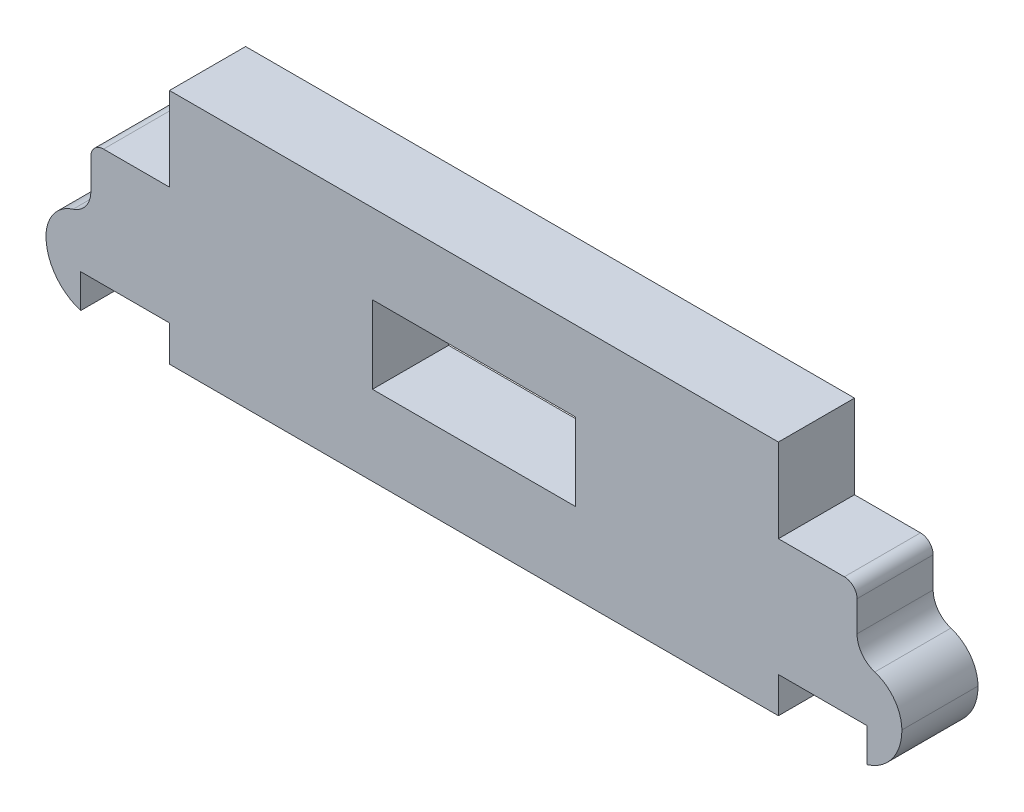
ISO-10303-21;
HEADER;
FILE_DESCRIPTION(('STEP AP214'),'2;1');
FILE_NAME('part.step','',(''),(''),'','','');
FILE_SCHEMA(('AUTOMOTIVE_DESIGN { 1 0 10303 214 1 1 1 1 }'));
ENDSEC;
DATA;
#1=APPLICATION_CONTEXT('core data for automotive mechanical design processes');
#2=APPLICATION_PROTOCOL_DEFINITION('international standard','automotive_design',2000,#1);
#3=PRODUCT_CONTEXT('',#1,'mechanical');
#4=PRODUCT('Part','Part','',(#3));
#5=PRODUCT_RELATED_PRODUCT_CATEGORY('part','',(#4));
#6=PRODUCT_DEFINITION_FORMATION('','',#4);
#7=PRODUCT_DEFINITION_CONTEXT('part definition',#1,'design');
#8=PRODUCT_DEFINITION('design','',#6,#7);
#9=PRODUCT_DEFINITION_SHAPE('','',#8);
#10=(LENGTH_UNIT() NAMED_UNIT(*) SI_UNIT(.MILLI.,.METRE.));
#11=(NAMED_UNIT(*) PLANE_ANGLE_UNIT() SI_UNIT($,.RADIAN.));
#12=(NAMED_UNIT(*) SI_UNIT($,.STERADIAN.) SOLID_ANGLE_UNIT());
#13=UNCERTAINTY_MEASURE_WITH_UNIT(LENGTH_MEASURE(1.E-05),#10,'distance_accuracy_value','');
#14=(GEOMETRIC_REPRESENTATION_CONTEXT(3) GLOBAL_UNCERTAINTY_ASSIGNED_CONTEXT((#13)) GLOBAL_UNIT_ASSIGNED_CONTEXT((#10,
#11,#12)) REPRESENTATION_CONTEXT('',''));
#15=CARTESIAN_POINT('',(0.,0.,0.));
#16=DIRECTION('',(0.,0.,1.));
#17=DIRECTION('',(1.,0.,0.));
#18=AXIS2_PLACEMENT_3D('',#15,#16,#17);
#19=CARTESIAN_POINT('',(-12.6829602097145,5.79977927389886,1.5));
#20=DIRECTION('',(0.,0.,1.));
#21=DIRECTION('',(1.,0.,0.));
#22=AXIS2_PLACEMENT_3D('',#19,#20,#21);
#23=PLANE('',#22);
#24=DIRECTION('',(-1.,0.,0.));
#25=VECTOR('',#24,1.);
#26=CARTESIAN_POINT('',(13.9162907842314,9.59977927389854,1.5));
#27=LINE('',#26,#25);
#28=CARTESIAN_POINT('',(13.9162907842314,9.59977927389854,1.5));
#29=VERTEX_POINT('',#28);
#30=CARTESIAN_POINT('',(-10.0837092157686,9.59977927389854,1.5));
#31=VERTEX_POINT('',#30);
#32=EDGE_CURVE('E243',#29,#31,#27,.T.);
#33=ORIENTED_EDGE('',*,*,#32,.T.);
#34=DIRECTION('',(0.,-1.,0.));
#35=VECTOR('',#34,1.);
#36=CARTESIAN_POINT('',(-10.0837092157686,9.59977927389854,1.5));
#37=LINE('',#36,#35);
#38=CARTESIAN_POINT('',(-10.0837092157686,6.2997792738988,1.5));
#39=VERTEX_POINT('',#38);
#40=EDGE_CURVE('E246',#31,#39,#37,.T.);
#41=ORIENTED_EDGE('',*,*,#40,.T.);
#42=DIRECTION('',(-1.,0.,0.));
#43=VECTOR('',#42,1.);
#44=CARTESIAN_POINT('',(-10.0837092157686,6.2997792738988,1.5));
#45=LINE('',#44,#43);
#46=CARTESIAN_POINT('',(-12.6829602097145,6.2997792738988,1.5));
#47=VERTEX_POINT('',#46);
#48=EDGE_CURVE('E249',#39,#47,#45,.T.);
#49=ORIENTED_EDGE('',*,*,#48,.T.);
#50=CARTESIAN_POINT('',(-12.6829602097145,5.79977927389886,1.5));
#51=DIRECTION('',(0.,0.,1.));
#52=DIRECTION('',(1.,0.,0.));
#53=AXIS2_PLACEMENT_3D('',#50,#51,#52);
#54=CIRCLE('',#53,0.499999999999941);
#55=CARTESIAN_POINT('',(-13.1829602097144,5.79977927389886,1.5));
#56=VERTEX_POINT('',#55);
#57=EDGE_CURVE('E251',#47,#56,#54,.T.);
#58=ORIENTED_EDGE('',*,*,#57,.T.);
#59=DIRECTION('',(0.,-1.,0.));
#60=VECTOR('',#59,1.);
#61=CARTESIAN_POINT('',(-13.1829602097144,5.79977927389886,1.5));
#62=LINE('',#61,#60);
#63=CARTESIAN_POINT('',(-13.1829602097144,4.60236878244591,1.5));
#64=VERTEX_POINT('',#63);
#65=EDGE_CURVE('E253',#56,#64,#62,.T.);
#66=ORIENTED_EDGE('',*,*,#65,.T.);
#67=CARTESIAN_POINT('',(-14.1829602097144,4.60236878244591,1.5));
#68=DIRECTION('',(0.,0.,-1.));
#69=DIRECTION('',(-1.,0.,0.));
#70=AXIS2_PLACEMENT_3D('',#67,#68,#69);
#71=CIRCLE('',#70,0.999999999999995);
#72=CARTESIAN_POINT('',(-13.882635600724,3.64853172653189,1.5));
#73=VERTEX_POINT('',#72);
#74=EDGE_CURVE('E255',#64,#73,#71,.T.);
#75=ORIENTED_EDGE('',*,*,#74,.T.);
#76=CARTESIAN_POINT('',(-13.4242999372272,2.19284835326531,1.5));
#77=DIRECTION('',(0.,0.,1.));
#78=DIRECTION('',(1.,0.,0.));
#79=AXIS2_PLACEMENT_3D('',#76,#77,#78);
#80=CIRCLE('',#79,1.52613422202562);
#81=CARTESIAN_POINT('',(-14.9503955953387,2.20369758969219,1.5));
#82=VERTEX_POINT('',#81);
#83=EDGE_CURVE('E257',#73,#82,#80,.T.);
#84=ORIENTED_EDGE('',*,*,#83,.T.);
#85=CARTESIAN_POINT('',(-13.0087350751829,2.18989404210202,1.5));
#86=DIRECTION('',(0.,0.,1.));
#87=DIRECTION('',(1.,0.,0.));
#88=AXIS2_PLACEMENT_3D('',#85,#86,#87);
#89=CIRCLE('',#88,1.94170958525156);
#90=CARTESIAN_POINT('',(-13.5837092157686,0.335267165580615,1.5));
#91=VERTEX_POINT('',#90);
#92=EDGE_CURVE('E259',#82,#91,#89,.T.);
#93=ORIENTED_EDGE('',*,*,#92,.T.);
#94=DIRECTION('',(0.,1.,0.));
#95=VECTOR('',#94,1.);
#96=CARTESIAN_POINT('',(-13.5837092157686,0.335267165580616,1.5));
#97=LINE('',#96,#95);
#98=CARTESIAN_POINT('',(-13.5837092157686,1.66469561199123,1.5));
#99=VERTEX_POINT('',#98);
#100=EDGE_CURVE('E261',#91,#99,#97,.T.);
#101=ORIENTED_EDGE('',*,*,#100,.T.);
#102=DIRECTION('',(1.,0.,0.));
#103=VECTOR('',#102,1.);
#104=CARTESIAN_POINT('',(-13.5837092157686,1.66469561199123,1.5));
#105=LINE('',#104,#103);
#106=CARTESIAN_POINT('',(-10.0837092157686,1.66469561199123,1.5));
#107=VERTEX_POINT('',#106);
#108=EDGE_CURVE('E263',#99,#107,#105,.T.);
#109=ORIENTED_EDGE('',*,*,#108,.T.);
#110=DIRECTION('',(1.52707640084291E-13,-1.,0.));
#111=VECTOR('',#110,1.);
#112=CARTESIAN_POINT('',(-10.0837092157686,1.66469561199123,1.5));
#113=LINE('',#112,#111);
#114=CARTESIAN_POINT('',(-10.0837092157684,0.256084288403286,1.5));
#115=VERTEX_POINT('',#114);
#116=EDGE_CURVE('E265',#107,#115,#113,.T.);
#117=ORIENTED_EDGE('',*,*,#116,.T.);
#118=DIRECTION('',(1.,0.,0.));
#119=VECTOR('',#118,1.);
#120=CARTESIAN_POINT('',(-10.0837092157684,0.256084288403286,1.5));
#121=LINE('',#120,#119);
#122=CARTESIAN_POINT('',(13.9162907842312,0.256084288403289,1.5));
#123=VERTEX_POINT('',#122);
#124=EDGE_CURVE('E267',#115,#123,#121,.T.);
#125=ORIENTED_EDGE('',*,*,#124,.T.);
#126=DIRECTION('',(1.50244613631318E-13,1.,0.));
#127=VECTOR('',#126,1.);
#128=CARTESIAN_POINT('',(13.9162907842314,1.66469561199123,1.5));
#129=LINE('',#128,#127);
#130=CARTESIAN_POINT('',(13.9162907842314,1.66469561199123,1.5));
#131=VERTEX_POINT('',#130);
#132=EDGE_CURVE('E269',#123,#131,#129,.T.);
#133=ORIENTED_EDGE('',*,*,#132,.T.);
#134=DIRECTION('',(1.,0.,0.));
#135=VECTOR('',#134,1.);
#136=CARTESIAN_POINT('',(17.4162907842314,1.66469561199123,1.5));
#137=LINE('',#136,#135);
#138=CARTESIAN_POINT('',(17.4162907842314,1.66469561199123,1.5));
#139=VERTEX_POINT('',#138);
#140=EDGE_CURVE('E271',#131,#139,#137,.T.);
#141=ORIENTED_EDGE('',*,*,#140,.T.);
#142=DIRECTION('',(0.,-1.,0.));
#143=VECTOR('',#142,1.);
#144=CARTESIAN_POINT('',(17.4162907842314,0.33526716558062,1.5));
#145=LINE('',#144,#143);
#146=CARTESIAN_POINT('',(17.4162907842314,0.33526716558062,1.5));
#147=VERTEX_POINT('',#146);
#148=EDGE_CURVE('E273',#139,#147,#145,.T.);
#149=ORIENTED_EDGE('',*,*,#148,.T.);
#150=CARTESIAN_POINT('',(16.8413166436457,2.18989404210202,1.5));
#151=DIRECTION('',(0.,0.,1.));
#152=DIRECTION('',(-1.,0.,0.));
#153=AXIS2_PLACEMENT_3D('',#150,#151,#152);
#154=CIRCLE('',#153,1.94170958525156);
#155=CARTESIAN_POINT('',(18.7829771638015,2.20369758969219,1.5));
#156=VERTEX_POINT('',#155);
#157=EDGE_CURVE('E275',#147,#156,#154,.T.);
#158=ORIENTED_EDGE('',*,*,#157,.T.);
#159=CARTESIAN_POINT('',(17.25688150569,2.19284835326532,1.5));
#160=DIRECTION('',(0.,0.,1.));
#161=DIRECTION('',(-1.,0.,0.));
#162=AXIS2_PLACEMENT_3D('',#159,#160,#161);
#163=CIRCLE('',#162,1.52613422202562);
#164=CARTESIAN_POINT('',(17.7152171691868,3.64853172653189,1.5));
#165=VERTEX_POINT('',#164);
#166=EDGE_CURVE('E277',#156,#165,#163,.T.);
#167=ORIENTED_EDGE('',*,*,#166,.T.);
#168=CARTESIAN_POINT('',(18.0155417781772,4.60236878244592,1.5));
#169=DIRECTION('',(0.,0.,-1.));
#170=DIRECTION('',(1.,0.,0.));
#171=AXIS2_PLACEMENT_3D('',#168,#169,#170);
#172=CIRCLE('',#171,0.999999999999995);
#173=CARTESIAN_POINT('',(17.0155417781772,4.60236878244592,1.5));
#174=VERTEX_POINT('',#173);
#175=EDGE_CURVE('E279',#165,#174,#172,.T.);
#176=ORIENTED_EDGE('',*,*,#175,.T.);
#177=DIRECTION('',(0.,1.,0.));
#178=VECTOR('',#177,1.);
#179=CARTESIAN_POINT('',(17.0155417781772,5.79977927389886,1.5));
#180=LINE('',#179,#178);
#181=CARTESIAN_POINT('',(17.0155417781772,5.79977927389886,1.5));
#182=VERTEX_POINT('',#181);
#183=EDGE_CURVE('E281',#174,#182,#180,.T.);
#184=ORIENTED_EDGE('',*,*,#183,.T.);
#185=CARTESIAN_POINT('',(16.5155417781772,5.79977927389886,1.5));
#186=DIRECTION('',(0.,0.,1.));
#187=DIRECTION('',(-1.,0.,0.));
#188=AXIS2_PLACEMENT_3D('',#185,#186,#187);
#189=CIRCLE('',#188,0.499999999999941);
#190=CARTESIAN_POINT('',(16.5155417781772,6.2997792738988,1.5));
#191=VERTEX_POINT('',#190);
#192=EDGE_CURVE('E283',#182,#191,#189,.T.);
#193=ORIENTED_EDGE('',*,*,#192,.T.);
#194=DIRECTION('',(-1.,0.,0.));
#195=VECTOR('',#194,1.);
#196=CARTESIAN_POINT('',(13.9162907842314,6.2997792738988,1.5));
#197=LINE('',#196,#195);
#198=CARTESIAN_POINT('',(13.9162907842314,6.2997792738988,1.5));
#199=VERTEX_POINT('',#198);
#200=EDGE_CURVE('E285',#191,#199,#197,.T.);
#201=ORIENTED_EDGE('',*,*,#200,.T.);
#202=DIRECTION('',(0.,1.,0.));
#203=VECTOR('',#202,1.);
#204=CARTESIAN_POINT('',(13.9162907842314,9.59977927389854,1.5));
#205=LINE('',#204,#203);
#206=EDGE_CURVE('E287',#199,#29,#205,.T.);
#207=ORIENTED_EDGE('',*,*,#206,.T.);
#208=EDGE_LOOP('',(#33,#41,#49,#58,#66,#75,#84,#93,#101,#109,#117,#125,#133,#141,#149,#158,#167,
#176,#184,#193,#201,#207));
#209=FACE_BOUND('',#208,.T.);
#210=DIRECTION('',(-1.,0.,0.));
#211=VECTOR('',#210,1.);
#212=CARTESIAN_POINT('',(-2.08370921576841,6.45608428840361,1.5));
#213=LINE('',#212,#211);
#214=CARTESIAN_POINT('',(5.91629078423138,6.45608428840361,1.5));
#215=VERTEX_POINT('',#214);
#216=CARTESIAN_POINT('',(-2.08370921576841,6.45608428840361,1.5));
#217=VERTEX_POINT('',#216);
#218=EDGE_CURVE('E215',#215,#217,#213,.T.);
#219=ORIENTED_EDGE('',*,*,#218,.F.);
#220=DIRECTION('',(0.,1.,0.));
#221=VECTOR('',#220,1.);
#222=CARTESIAN_POINT('',(5.91629078423138,3.39977927389822,1.5));
#223=LINE('',#222,#221);
#224=CARTESIAN_POINT('',(5.91629078423138,3.39977927389822,1.5));
#225=VERTEX_POINT('',#224);
#226=EDGE_CURVE('E207',#225,#215,#223,.T.);
#227=ORIENTED_EDGE('',*,*,#226,.F.);
#228=DIRECTION('',(1.,0.,0.));
#229=VECTOR('',#228,1.);
#230=CARTESIAN_POINT('',(-2.08370921576841,3.39977927389822,1.5));
#231=LINE('',#230,#229);
#232=CARTESIAN_POINT('',(-2.08370921576841,3.39977927389822,1.5));
#233=VERTEX_POINT('',#232);
#234=EDGE_CURVE('E229',#233,#225,#231,.T.);
#235=ORIENTED_EDGE('',*,*,#234,.F.);
#236=DIRECTION('',(0.,-1.,0.));
#237=VECTOR('',#236,1.);
#238=CARTESIAN_POINT('',(-2.08370921576841,3.39977927389822,1.5));
#239=LINE('',#238,#237);
#240=EDGE_CURVE('E227',#217,#233,#239,.T.);
#241=ORIENTED_EDGE('',*,*,#240,.F.);
#242=EDGE_LOOP('',(#219,#227,#235,#241));
#243=FACE_BOUND('',#242,.T.);
#244=ADVANCED_FACE('F34',(#209,#243),#23,.T.);
#245=CARTESIAN_POINT('',(-12.6829602097145,5.79977927389886,-1.5));
#246=DIRECTION('',(0.,0.,1.));
#247=DIRECTION('',(1.,0.,0.));
#248=AXIS2_PLACEMENT_3D('',#245,#246,#247);
#249=PLANE('',#248);
#250=DIRECTION('',(-1.,0.,0.));
#251=VECTOR('',#250,1.);
#252=CARTESIAN_POINT('',(13.9162907842314,9.59977927389854,-1.5));
#253=LINE('',#252,#251);
#254=CARTESIAN_POINT('',(13.9162907842314,9.59977927389854,-1.5));
#255=VERTEX_POINT('',#254);
#256=CARTESIAN_POINT('',(-10.0837092157686,9.59977927389854,-1.5));
#257=VERTEX_POINT('',#256);
#258=EDGE_CURVE('E223',#255,#257,#253,.T.);
#259=ORIENTED_EDGE('',*,*,#258,.F.);
#260=DIRECTION('',(0.,1.,0.));
#261=VECTOR('',#260,1.);
#262=CARTESIAN_POINT('',(13.9162907842314,9.59977927389854,-1.5));
#263=LINE('',#262,#261);
#264=CARTESIAN_POINT('',(13.9162907842314,6.2997792738988,-1.5));
#265=VERTEX_POINT('',#264);
#266=EDGE_CURVE('E247',#265,#255,#263,.T.);
#267=ORIENTED_EDGE('',*,*,#266,.F.);
#268=DIRECTION('',(-1.,0.,0.));
#269=VECTOR('',#268,1.);
#270=CARTESIAN_POINT('',(13.9162907842314,6.2997792738988,-1.5));
#271=LINE('',#270,#269);
#272=CARTESIAN_POINT('',(16.5155417781772,6.2997792738988,-1.5));
#273=VERTEX_POINT('',#272);
#274=EDGE_CURVE('E330',#273,#265,#271,.T.);
#275=ORIENTED_EDGE('',*,*,#274,.F.);
#276=CARTESIAN_POINT('',(16.5155417781772,5.79977927389886,-1.5));
#277=DIRECTION('',(0.,0.,1.));
#278=DIRECTION('',(-1.,0.,0.));
#279=AXIS2_PLACEMENT_3D('',#276,#277,#278);
#280=CIRCLE('',#279,0.499999999999941);
#281=CARTESIAN_POINT('',(17.0155417781772,5.79977927389886,-1.5));
#282=VERTEX_POINT('',#281);
#283=EDGE_CURVE('E328',#282,#273,#280,.T.);
#284=ORIENTED_EDGE('',*,*,#283,.F.);
#285=DIRECTION('',(0.,1.,0.));
#286=VECTOR('',#285,1.);
#287=CARTESIAN_POINT('',(17.0155417781772,5.79977927389886,-1.5));
#288=LINE('',#287,#286);
#289=CARTESIAN_POINT('',(17.0155417781772,4.60236878244592,-1.5));
#290=VERTEX_POINT('',#289);
#291=EDGE_CURVE('E326',#290,#282,#288,.T.);
#292=ORIENTED_EDGE('',*,*,#291,.F.);
#293=CARTESIAN_POINT('',(18.0155417781772,4.60236878244592,-1.5));
#294=DIRECTION('',(0.,0.,-1.));
#295=DIRECTION('',(1.,0.,0.));
#296=AXIS2_PLACEMENT_3D('',#293,#294,#295);
#297=CIRCLE('',#296,0.999999999999995);
#298=CARTESIAN_POINT('',(17.7152171691868,3.64853172653189,-1.5));
#299=VERTEX_POINT('',#298);
#300=EDGE_CURVE('E324',#299,#290,#297,.T.);
#301=ORIENTED_EDGE('',*,*,#300,.F.);
#302=CARTESIAN_POINT('',(17.25688150569,2.19284835326532,-1.5));
#303=DIRECTION('',(0.,0.,1.));
#304=DIRECTION('',(-1.,0.,0.));
#305=AXIS2_PLACEMENT_3D('',#302,#303,#304);
#306=CIRCLE('',#305,1.52613422202562);
#307=CARTESIAN_POINT('',(18.7829771638015,2.20369758969219,-1.5));
#308=VERTEX_POINT('',#307);
#309=EDGE_CURVE('E322',#308,#299,#306,.T.);
#310=ORIENTED_EDGE('',*,*,#309,.F.);
#311=CARTESIAN_POINT('',(16.8413166436457,2.18989404210202,-1.5));
#312=DIRECTION('',(0.,0.,1.));
#313=DIRECTION('',(-1.,0.,0.));
#314=AXIS2_PLACEMENT_3D('',#311,#312,#313);
#315=CIRCLE('',#314,1.94170958525156);
#316=CARTESIAN_POINT('',(17.4162907842314,0.33526716558062,-1.5));
#317=VERTEX_POINT('',#316);
#318=EDGE_CURVE('E320',#317,#308,#315,.T.);
#319=ORIENTED_EDGE('',*,*,#318,.F.);
#320=DIRECTION('',(0.,-1.,0.));
#321=VECTOR('',#320,1.);
#322=CARTESIAN_POINT('',(17.4162907842314,0.33526716558062,-1.5));
#323=LINE('',#322,#321);
#324=CARTESIAN_POINT('',(17.4162907842314,1.66469561199123,-1.5));
#325=VERTEX_POINT('',#324);
#326=EDGE_CURVE('E318',#325,#317,#323,.T.);
#327=ORIENTED_EDGE('',*,*,#326,.F.);
#328=DIRECTION('',(1.,0.,0.));
#329=VECTOR('',#328,1.);
#330=CARTESIAN_POINT('',(17.4162907842314,1.66469561199123,-1.5));
#331=LINE('',#330,#329);
#332=CARTESIAN_POINT('',(13.9162907842314,1.66469561199123,-1.5));
#333=VERTEX_POINT('',#332);
#334=EDGE_CURVE('E316',#333,#325,#331,.T.);
#335=ORIENTED_EDGE('',*,*,#334,.F.);
#336=DIRECTION('',(1.50244613631318E-13,1.,0.));
#337=VECTOR('',#336,1.);
#338=CARTESIAN_POINT('',(13.9162907842314,1.66469561199123,-1.5));
#339=LINE('',#338,#337);
#340=CARTESIAN_POINT('',(13.9162907842312,0.256084288403289,-1.5));
#341=VERTEX_POINT('',#340);
#342=EDGE_CURVE('E314',#341,#333,#339,.T.);
#343=ORIENTED_EDGE('',*,*,#342,.F.);
#344=DIRECTION('',(1.,0.,0.));
#345=VECTOR('',#344,1.);
#346=CARTESIAN_POINT('',(-10.0837092157684,0.256084288403286,-1.5));
#347=LINE('',#346,#345);
#348=CARTESIAN_POINT('',(-10.0837092157684,0.256084288403286,-1.5));
#349=VERTEX_POINT('',#348);
#350=EDGE_CURVE('E312',#349,#341,#347,.T.);
#351=ORIENTED_EDGE('',*,*,#350,.F.);
#352=DIRECTION('',(1.52707640084291E-13,-1.,0.));
#353=VECTOR('',#352,1.);
#354=CARTESIAN_POINT('',(-10.0837092157686,1.66469561199123,-1.5));
#355=LINE('',#354,#353);
#356=CARTESIAN_POINT('',(-10.0837092157686,1.66469561199123,-1.5));
#357=VERTEX_POINT('',#356);
#358=EDGE_CURVE('E310',#357,#349,#355,.T.);
#359=ORIENTED_EDGE('',*,*,#358,.F.);
#360=DIRECTION('',(1.,0.,0.));
#361=VECTOR('',#360,1.);
#362=CARTESIAN_POINT('',(-13.5837092157686,1.66469561199123,-1.5));
#363=LINE('',#362,#361);
#364=CARTESIAN_POINT('',(-13.5837092157686,1.66469561199123,-1.5));
#365=VERTEX_POINT('',#364);
#366=EDGE_CURVE('E308',#365,#357,#363,.T.);
#367=ORIENTED_EDGE('',*,*,#366,.F.);
#368=DIRECTION('',(0.,1.,0.));
#369=VECTOR('',#368,1.);
#370=CARTESIAN_POINT('',(-13.5837092157686,0.335267165580616,-1.5));
#371=LINE('',#370,#369);
#372=CARTESIAN_POINT('',(-13.5837092157686,0.335267165580615,-1.5));
#373=VERTEX_POINT('',#372);
#374=EDGE_CURVE('E306',#373,#365,#371,.T.);
#375=ORIENTED_EDGE('',*,*,#374,.F.);
#376=CARTESIAN_POINT('',(-13.0087350751829,2.18989404210202,-1.5));
#377=DIRECTION('',(0.,0.,1.));
#378=DIRECTION('',(1.,0.,0.));
#379=AXIS2_PLACEMENT_3D('',#376,#377,#378);
#380=CIRCLE('',#379,1.94170958525156);
#381=CARTESIAN_POINT('',(-14.9503955953387,2.20369758969219,-1.5));
#382=VERTEX_POINT('',#381);
#383=EDGE_CURVE('E304',#382,#373,#380,.T.);
#384=ORIENTED_EDGE('',*,*,#383,.F.);
#385=CARTESIAN_POINT('',(-13.4242999372272,2.19284835326531,-1.5));
#386=DIRECTION('',(0.,0.,1.));
#387=DIRECTION('',(1.,0.,0.));
#388=AXIS2_PLACEMENT_3D('',#385,#386,#387);
#389=CIRCLE('',#388,1.52613422202562);
#390=CARTESIAN_POINT('',(-13.882635600724,3.64853172653189,-1.5));
#391=VERTEX_POINT('',#390);
#392=EDGE_CURVE('E302',#391,#382,#389,.T.);
#393=ORIENTED_EDGE('',*,*,#392,.F.);
#394=CARTESIAN_POINT('',(-14.1829602097144,4.60236878244591,-1.5));
#395=DIRECTION('',(0.,0.,-1.));
#396=DIRECTION('',(-1.,0.,0.));
#397=AXIS2_PLACEMENT_3D('',#394,#395,#396);
#398=CIRCLE('',#397,0.999999999999995);
#399=CARTESIAN_POINT('',(-13.1829602097144,4.60236878244591,-1.5));
#400=VERTEX_POINT('',#399);
#401=EDGE_CURVE('E300',#400,#391,#398,.T.);
#402=ORIENTED_EDGE('',*,*,#401,.F.);
#403=DIRECTION('',(0.,-1.,0.));
#404=VECTOR('',#403,1.);
#405=CARTESIAN_POINT('',(-13.1829602097144,5.79977927389886,-1.5));
#406=LINE('',#405,#404);
#407=CARTESIAN_POINT('',(-13.1829602097144,5.79977927389886,-1.5));
#408=VERTEX_POINT('',#407);
#409=EDGE_CURVE('E298',#408,#400,#406,.T.);
#410=ORIENTED_EDGE('',*,*,#409,.F.);
#411=CARTESIAN_POINT('',(-12.6829602097145,5.79977927389886,-1.5));
#412=DIRECTION('',(0.,0.,1.));
#413=DIRECTION('',(1.,0.,0.));
#414=AXIS2_PLACEMENT_3D('',#411,#412,#413);
#415=CIRCLE('',#414,0.499999999999941);
#416=CARTESIAN_POINT('',(-12.6829602097145,6.2997792738988,-1.5));
#417=VERTEX_POINT('',#416);
#418=EDGE_CURVE('E296',#417,#408,#415,.T.);
#419=ORIENTED_EDGE('',*,*,#418,.F.);
#420=DIRECTION('',(-1.,0.,0.));
#421=VECTOR('',#420,1.);
#422=CARTESIAN_POINT('',(-10.0837092157686,6.2997792738988,-1.5));
#423=LINE('',#422,#421);
#424=CARTESIAN_POINT('',(-10.0837092157686,6.2997792738988,-1.5));
#425=VERTEX_POINT('',#424);
#426=EDGE_CURVE('E294',#425,#417,#423,.T.);
#427=ORIENTED_EDGE('',*,*,#426,.F.);
#428=DIRECTION('',(0.,-1.,0.));
#429=VECTOR('',#428,1.);
#430=CARTESIAN_POINT('',(-10.0837092157686,9.59977927389854,-1.5));
#431=LINE('',#430,#429);
#432=EDGE_CURVE('E292',#257,#425,#431,.T.);
#433=ORIENTED_EDGE('',*,*,#432,.F.);
#434=EDGE_LOOP('',(#259,#267,#275,#284,#292,#301,#310,#319,#327,#335,#343,#351,#359,#367,#375,
#384,#393,#402,#410,#419,#427,#433));
#435=FACE_BOUND('',#434,.T.);
#436=DIRECTION('',(0.,1.,0.));
#437=VECTOR('',#436,1.);
#438=CARTESIAN_POINT('',(5.91629078423138,3.39977927389822,-1.5));
#439=LINE('',#438,#437);
#440=CARTESIAN_POINT('',(5.91629078423138,3.39977927389822,-1.5));
#441=VERTEX_POINT('',#440);
#442=CARTESIAN_POINT('',(5.91629078423138,6.45608428840361,-1.5));
#443=VERTEX_POINT('',#442);
#444=EDGE_CURVE('E57',#441,#443,#439,.T.);
#445=ORIENTED_EDGE('',*,*,#444,.T.);
#446=DIRECTION('',(-1.,0.,0.));
#447=VECTOR('',#446,1.);
#448=CARTESIAN_POINT('',(-2.08370921576841,6.45608428840361,-1.5));
#449=LINE('',#448,#447);
#450=CARTESIAN_POINT('',(-2.08370921576841,6.45608428840361,-1.5));
#451=VERTEX_POINT('',#450);
#452=EDGE_CURVE('E222',#443,#451,#449,.T.);
#453=ORIENTED_EDGE('',*,*,#452,.T.);
#454=DIRECTION('',(0.,-1.,0.));
#455=VECTOR('',#454,1.);
#456=CARTESIAN_POINT('',(-2.08370921576841,3.39977927389822,-1.5));
#457=LINE('',#456,#455);
#458=CARTESIAN_POINT('',(-2.08370921576841,3.39977927389822,-1.5));
#459=VERTEX_POINT('',#458);
#460=EDGE_CURVE('E235',#451,#459,#457,.T.);
#461=ORIENTED_EDGE('',*,*,#460,.T.);
#462=DIRECTION('',(1.,0.,0.));
#463=VECTOR('',#462,1.);
#464=CARTESIAN_POINT('',(-2.08370921576841,3.39977927389822,-1.5));
#465=LINE('',#464,#463);
#466=EDGE_CURVE('E216',#459,#441,#465,.T.);
#467=ORIENTED_EDGE('',*,*,#466,.T.);
#468=EDGE_LOOP('',(#445,#453,#461,#467));
#469=FACE_BOUND('',#468,.T.);
#470=ADVANCED_FACE('F402',(#435,#469),#249,.F.);
#471=CARTESIAN_POINT('',(13.9162907842314,9.59977927389854,1.5));
#472=DIRECTION('',(0.,-1.,0.));
#473=DIRECTION('',(1.,0.,0.));
#474=AXIS2_PLACEMENT_3D('',#471,#472,#473);
#475=PLANE('',#474);
#476=ORIENTED_EDGE('',*,*,#258,.T.);
#477=DIRECTION('',(0.,0.,-1.));
#478=VECTOR('',#477,1.);
#479=CARTESIAN_POINT('',(-10.0837092157686,9.59977927389854,1.5));
#480=LINE('',#479,#478);
#481=EDGE_CURVE('E11',#31,#257,#480,.T.);
#482=ORIENTED_EDGE('',*,*,#481,.F.);
#483=ORIENTED_EDGE('',*,*,#32,.F.);
#484=DIRECTION('',(0.,0.,-1.));
#485=VECTOR('',#484,1.);
#486=CARTESIAN_POINT('',(13.9162907842314,9.59977927389854,1.5));
#487=LINE('',#486,#485);
#488=EDGE_CURVE('E289',#29,#255,#487,.T.);
#489=ORIENTED_EDGE('',*,*,#488,.T.);
#490=EDGE_LOOP('',(#476,#482,#483,#489));
#491=FACE_BOUND('',#490,.T.);
#492=ADVANCED_FACE('F36',(#491),#475,.F.);
#493=CARTESIAN_POINT('',(-10.0837092157686,9.59977927389854,1.5));
#494=DIRECTION('',(1.,0.,0.));
#495=DIRECTION('',(0.,1.,0.));
#496=AXIS2_PLACEMENT_3D('',#493,#494,#495);
#497=PLANE('',#496);
#498=ORIENTED_EDGE('',*,*,#432,.T.);
#499=DIRECTION('',(0.,0.,-1.));
#500=VECTOR('',#499,1.);
#501=CARTESIAN_POINT('',(-10.0837092157686,6.2997792738988,1.5));
#502=LINE('',#501,#500);
#503=EDGE_CURVE('E42',#39,#425,#502,.T.);
#504=ORIENTED_EDGE('',*,*,#503,.F.);
#505=ORIENTED_EDGE('',*,*,#40,.F.);
#506=ORIENTED_EDGE('',*,*,#481,.T.);
#507=EDGE_LOOP('',(#498,#504,#505,#506));
#508=FACE_BOUND('',#507,.T.);
#509=ADVANCED_FACE('F419',(#508),#497,.F.);
#510=CARTESIAN_POINT('',(-10.0837092157686,6.2997792738988,1.5));
#511=DIRECTION('',(0.,-1.,0.));
#512=DIRECTION('',(0.,0.,-1.));
#513=AXIS2_PLACEMENT_3D('',#510,#511,#512);
#514=PLANE('',#513);
#515=ORIENTED_EDGE('',*,*,#426,.T.);
#516=DIRECTION('',(0.,0.,-1.));
#517=VECTOR('',#516,1.);
#518=CARTESIAN_POINT('',(-12.6829602097145,6.2997792738988,1.5));
#519=LINE('',#518,#517);
#520=EDGE_CURVE('E389',#47,#417,#519,.T.);
#521=ORIENTED_EDGE('',*,*,#520,.F.);
#522=ORIENTED_EDGE('',*,*,#48,.F.);
#523=ORIENTED_EDGE('',*,*,#503,.T.);
#524=EDGE_LOOP('',(#515,#521,#522,#523));
#525=FACE_BOUND('',#524,.T.);
#526=ADVANCED_FACE('F396',(#525),#514,.F.);
#527=CARTESIAN_POINT('',(-12.6829602097145,5.79977927389886,1.5));
#528=DIRECTION('',(0.,0.,-1.));
#529=DIRECTION('',(-1.,0.,0.));
#530=AXIS2_PLACEMENT_3D('',#527,#528,#529);
#531=CYLINDRICAL_SURFACE('',#530,0.499999999999941);
#532=ORIENTED_EDGE('',*,*,#418,.T.);
#533=DIRECTION('',(0.,0.,-1.));
#534=VECTOR('',#533,1.);
#535=CARTESIAN_POINT('',(-13.1829602097144,5.79977927389886,1.5));
#536=LINE('',#535,#534);
#537=EDGE_CURVE('E386',#56,#408,#536,.T.);
#538=ORIENTED_EDGE('',*,*,#537,.F.);
#539=ORIENTED_EDGE('',*,*,#57,.F.);
#540=ORIENTED_EDGE('',*,*,#520,.T.);
#541=EDGE_LOOP('',(#532,#538,#539,#540));
#542=FACE_BOUND('',#541,.T.);
#543=ADVANCED_FACE('F408',(#542),#531,.T.);
#544=CARTESIAN_POINT('',(-13.1829602097144,5.79977927389886,1.5));
#545=DIRECTION('',(1.,0.,0.));
#546=DIRECTION('',(0.,0.,-1.));
#547=AXIS2_PLACEMENT_3D('',#544,#545,#546);
#548=PLANE('',#547);
#549=ORIENTED_EDGE('',*,*,#409,.T.);
#550=DIRECTION('',(0.,0.,-1.));
#551=VECTOR('',#550,1.);
#552=CARTESIAN_POINT('',(-13.1829602097144,4.60236878244591,1.5));
#553=LINE('',#552,#551);
#554=EDGE_CURVE('E383',#64,#400,#553,.T.);
#555=ORIENTED_EDGE('',*,*,#554,.F.);
#556=ORIENTED_EDGE('',*,*,#65,.F.);
#557=ORIENTED_EDGE('',*,*,#537,.T.);
#558=EDGE_LOOP('',(#549,#555,#556,#557));
#559=FACE_BOUND('',#558,.T.);
#560=ADVANCED_FACE('F412',(#559),#548,.F.);
#561=CARTESIAN_POINT('',(-14.1829602097144,4.60236878244591,1.5));
#562=DIRECTION('',(0.,0.,-1.));
#563=DIRECTION('',(-1.,0.,0.));
#564=AXIS2_PLACEMENT_3D('',#561,#562,#563);
#565=CYLINDRICAL_SURFACE('',#564,0.999999999999995);
#566=ORIENTED_EDGE('',*,*,#401,.T.);
#567=DIRECTION('',(0.,0.,-1.));
#568=VECTOR('',#567,1.);
#569=CARTESIAN_POINT('',(-13.882635600724,3.64853172653189,1.5));
#570=LINE('',#569,#568);
#571=EDGE_CURVE('E380',#73,#391,#570,.T.);
#572=ORIENTED_EDGE('',*,*,#571,.F.);
#573=ORIENTED_EDGE('',*,*,#74,.F.);
#574=ORIENTED_EDGE('',*,*,#554,.T.);
#575=EDGE_LOOP('',(#566,#572,#573,#574));
#576=FACE_BOUND('',#575,.T.);
#577=ADVANCED_FACE('F502',(#576),#565,.F.);
#578=CARTESIAN_POINT('',(-13.4242999372272,2.19284835326531,1.5));
#579=DIRECTION('',(0.,0.,-1.));
#580=DIRECTION('',(-1.,0.,0.));
#581=AXIS2_PLACEMENT_3D('',#578,#579,#580);
#582=CYLINDRICAL_SURFACE('',#581,1.52613422202562);
#583=ORIENTED_EDGE('',*,*,#392,.T.);
#584=DIRECTION('',(0.,0.,-1.));
#585=VECTOR('',#584,1.);
#586=CARTESIAN_POINT('',(-14.9503955953387,2.20369758969219,1.5));
#587=LINE('',#586,#585);
#588=EDGE_CURVE('E377',#82,#382,#587,.T.);
#589=ORIENTED_EDGE('',*,*,#588,.F.);
#590=ORIENTED_EDGE('',*,*,#83,.F.);
#591=ORIENTED_EDGE('',*,*,#571,.T.);
#592=EDGE_LOOP('',(#583,#589,#590,#591));
#593=FACE_BOUND('',#592,.T.);
#594=ADVANCED_FACE('F499',(#593),#582,.T.);
#595=CARTESIAN_POINT('',(-13.0087350751829,2.18989404210202,1.5));
#596=DIRECTION('',(0.,0.,-1.));
#597=DIRECTION('',(-1.,0.,0.));
#598=AXIS2_PLACEMENT_3D('',#595,#596,#597);
#599=CYLINDRICAL_SURFACE('',#598,1.94170958525156);
#600=ORIENTED_EDGE('',*,*,#383,.T.);
#601=DIRECTION('',(0.,0.,-1.));
#602=VECTOR('',#601,1.);
#603=CARTESIAN_POINT('',(-13.5837092157686,0.335267165580615,1.5));
#604=LINE('',#603,#602);
#605=EDGE_CURVE('E374',#91,#373,#604,.T.);
#606=ORIENTED_EDGE('',*,*,#605,.F.);
#607=ORIENTED_EDGE('',*,*,#92,.F.);
#608=ORIENTED_EDGE('',*,*,#588,.T.);
#609=EDGE_LOOP('',(#600,#606,#607,#608));
#610=FACE_BOUND('',#609,.T.);
#611=ADVANCED_FACE('F495',(#610),#599,.T.);
#612=CARTESIAN_POINT('',(-13.5837092157686,0.335267165580616,1.5));
#613=DIRECTION('',(-1.,0.,0.));
#614=DIRECTION('',(0.,-1.,0.));
#615=AXIS2_PLACEMENT_3D('',#612,#613,#614);
#616=PLANE('',#615);
#617=ORIENTED_EDGE('',*,*,#374,.T.);
#618=DIRECTION('',(0.,0.,-1.));
#619=VECTOR('',#618,1.);
#620=CARTESIAN_POINT('',(-13.5837092157686,1.66469561199123,1.5));
#621=LINE('',#620,#619);
#622=EDGE_CURVE('E371',#99,#365,#621,.T.);
#623=ORIENTED_EDGE('',*,*,#622,.F.);
#624=ORIENTED_EDGE('',*,*,#100,.F.);
#625=ORIENTED_EDGE('',*,*,#605,.T.);
#626=EDGE_LOOP('',(#617,#623,#624,#625));
#627=FACE_BOUND('',#626,.T.);
#628=ADVANCED_FACE('F491',(#627),#616,.F.);
#629=CARTESIAN_POINT('',(-13.5837092157686,1.66469561199123,1.5));
#630=DIRECTION('',(0.,1.,0.));
#631=DIRECTION('',(0.,0.,1.));
#632=AXIS2_PLACEMENT_3D('',#629,#630,#631);
#633=PLANE('',#632);
#634=ORIENTED_EDGE('',*,*,#366,.T.);
#635=DIRECTION('',(0.,0.,-1.));
#636=VECTOR('',#635,1.);
#637=CARTESIAN_POINT('',(-10.0837092157686,1.66469561199123,1.5));
#638=LINE('',#637,#636);
#639=EDGE_CURVE('E368',#107,#357,#638,.T.);
#640=ORIENTED_EDGE('',*,*,#639,.F.);
#641=ORIENTED_EDGE('',*,*,#108,.F.);
#642=ORIENTED_EDGE('',*,*,#622,.T.);
#643=EDGE_LOOP('',(#634,#640,#641,#642));
#644=FACE_BOUND('',#643,.T.);
#645=ADVANCED_FACE('F486',(#644),#633,.F.);
#646=CARTESIAN_POINT('',(-10.0837092157686,1.66469561199123,1.5));
#647=DIRECTION('',(1.,1.52707640084291E-13,0.));
#648=DIRECTION('',(-1.52707640084291E-13,1.,0.));
#649=AXIS2_PLACEMENT_3D('',#646,#647,#648);
#650=PLANE('',#649);
#651=ORIENTED_EDGE('',*,*,#358,.T.);
#652=DIRECTION('',(0.,0.,-1.));
#653=VECTOR('',#652,1.);
#654=CARTESIAN_POINT('',(-10.0837092157684,0.256084288403286,1.5));
#655=LINE('',#654,#653);
#656=EDGE_CURVE('E365',#115,#349,#655,.T.);
#657=ORIENTED_EDGE('',*,*,#656,.F.);
#658=ORIENTED_EDGE('',*,*,#116,.F.);
#659=ORIENTED_EDGE('',*,*,#639,.T.);
#660=EDGE_LOOP('',(#651,#657,#658,#659));
#661=FACE_BOUND('',#660,.T.);
#662=ADVANCED_FACE('F480',(#661),#650,.F.);
#663=CARTESIAN_POINT('',(-10.0837092157684,0.256084288403286,1.5));
#664=DIRECTION('',(0.,1.,0.));
#665=DIRECTION('',(-1.,0.,0.));
#666=AXIS2_PLACEMENT_3D('',#663,#664,#665);
#667=PLANE('',#666);
#668=ORIENTED_EDGE('',*,*,#350,.T.);
#669=DIRECTION('',(0.,0.,-1.));
#670=VECTOR('',#669,1.);
#671=CARTESIAN_POINT('',(13.9162907842312,0.256084288403289,1.5));
#672=LINE('',#671,#670);
#673=EDGE_CURVE('E362',#123,#341,#672,.T.);
#674=ORIENTED_EDGE('',*,*,#673,.F.);
#675=ORIENTED_EDGE('',*,*,#124,.F.);
#676=ORIENTED_EDGE('',*,*,#656,.T.);
#677=EDGE_LOOP('',(#668,#674,#675,#676));
#678=FACE_BOUND('',#677,.T.);
#679=ADVANCED_FACE('F476',(#678),#667,.F.);
#680=CARTESIAN_POINT('',(13.9162907842314,1.66469561199123,1.5));
#681=DIRECTION('',(-1.,1.50244613631318E-13,0.));
#682=DIRECTION('',(-1.50244613631318E-13,-1.,0.));
#683=AXIS2_PLACEMENT_3D('',#680,#681,#682);
#684=PLANE('',#683);
#685=ORIENTED_EDGE('',*,*,#342,.T.);
#686=DIRECTION('',(0.,0.,-1.));
#687=VECTOR('',#686,1.);
#688=CARTESIAN_POINT('',(13.9162907842314,1.66469561199123,1.5));
#689=LINE('',#688,#687);
#690=EDGE_CURVE('E359',#131,#333,#689,.T.);
#691=ORIENTED_EDGE('',*,*,#690,.F.);
#692=ORIENTED_EDGE('',*,*,#132,.F.);
#693=ORIENTED_EDGE('',*,*,#673,.T.);
#694=EDGE_LOOP('',(#685,#691,#692,#693));
#695=FACE_BOUND('',#694,.T.);
#696=ADVANCED_FACE('F471',(#695),#684,.F.);
#697=CARTESIAN_POINT('',(17.4162907842314,1.66469561199123,1.5));
#698=DIRECTION('',(0.,1.,0.));
#699=DIRECTION('',(-1.,0.,0.));
#700=AXIS2_PLACEMENT_3D('',#697,#698,#699);
#701=PLANE('',#700);
#702=ORIENTED_EDGE('',*,*,#334,.T.);
#703=DIRECTION('',(0.,0.,-1.));
#704=VECTOR('',#703,1.);
#705=CARTESIAN_POINT('',(17.4162907842314,1.66469561199123,1.5));
#706=LINE('',#705,#704);
#707=EDGE_CURVE('E356',#139,#325,#706,.T.);
#708=ORIENTED_EDGE('',*,*,#707,.F.);
#709=ORIENTED_EDGE('',*,*,#140,.F.);
#710=ORIENTED_EDGE('',*,*,#690,.T.);
#711=EDGE_LOOP('',(#702,#708,#709,#710));
#712=FACE_BOUND('',#711,.T.);
#713=ADVANCED_FACE('F465',(#712),#701,.F.);
#714=CARTESIAN_POINT('',(17.4162907842314,0.33526716558062,1.5));
#715=DIRECTION('',(1.,0.,0.));
#716=DIRECTION('',(0.,1.,0.));
#717=AXIS2_PLACEMENT_3D('',#714,#715,#716);
#718=PLANE('',#717);
#719=ORIENTED_EDGE('',*,*,#326,.T.);
#720=DIRECTION('',(0.,0.,-1.));
#721=VECTOR('',#720,1.);
#722=CARTESIAN_POINT('',(17.4162907842314,0.33526716558062,1.5));
#723=LINE('',#722,#721);
#724=EDGE_CURVE('E353',#147,#317,#723,.T.);
#725=ORIENTED_EDGE('',*,*,#724,.F.);
#726=ORIENTED_EDGE('',*,*,#148,.F.);
#727=ORIENTED_EDGE('',*,*,#707,.T.);
#728=EDGE_LOOP('',(#719,#725,#726,#727));
#729=FACE_BOUND('',#728,.T.);
#730=ADVANCED_FACE('F461',(#729),#718,.F.);
#731=CARTESIAN_POINT('',(16.8413166436457,2.18989404210202,1.5));
#732=DIRECTION('',(0.,0.,-1.));
#733=DIRECTION('',(-1.,0.,0.));
#734=AXIS2_PLACEMENT_3D('',#731,#732,#733);
#735=CYLINDRICAL_SURFACE('',#734,1.94170958525156);
#736=ORIENTED_EDGE('',*,*,#318,.T.);
#737=DIRECTION('',(0.,0.,-1.));
#738=VECTOR('',#737,1.);
#739=CARTESIAN_POINT('',(18.7829771638015,2.20369758969219,1.5));
#740=LINE('',#739,#738);
#741=EDGE_CURVE('E350',#156,#308,#740,.T.);
#742=ORIENTED_EDGE('',*,*,#741,.F.);
#743=ORIENTED_EDGE('',*,*,#157,.F.);
#744=ORIENTED_EDGE('',*,*,#724,.T.);
#745=EDGE_LOOP('',(#736,#742,#743,#744));
#746=FACE_BOUND('',#745,.T.);
#747=ADVANCED_FACE('F456',(#746),#735,.T.);
#748=CARTESIAN_POINT('',(17.25688150569,2.19284835326532,1.5));
#749=DIRECTION('',(0.,0.,-1.));
#750=DIRECTION('',(-1.,0.,0.));
#751=AXIS2_PLACEMENT_3D('',#748,#749,#750);
#752=CYLINDRICAL_SURFACE('',#751,1.52613422202562);
#753=ORIENTED_EDGE('',*,*,#309,.T.);
#754=DIRECTION('',(0.,0.,-1.));
#755=VECTOR('',#754,1.);
#756=CARTESIAN_POINT('',(17.7152171691868,3.64853172653189,1.5));
#757=LINE('',#756,#755);
#758=EDGE_CURVE('E347',#165,#299,#757,.T.);
#759=ORIENTED_EDGE('',*,*,#758,.F.);
#760=ORIENTED_EDGE('',*,*,#166,.F.);
#761=ORIENTED_EDGE('',*,*,#741,.T.);
#762=EDGE_LOOP('',(#753,#759,#760,#761));
#763=FACE_BOUND('',#762,.T.);
#764=ADVANCED_FACE('F450',(#763),#752,.T.);
#765=CARTESIAN_POINT('',(18.0155417781772,4.60236878244592,1.5));
#766=DIRECTION('',(0.,0.,-1.));
#767=DIRECTION('',(-1.,0.,0.));
#768=AXIS2_PLACEMENT_3D('',#765,#766,#767);
#769=CYLINDRICAL_SURFACE('',#768,0.999999999999995);
#770=ORIENTED_EDGE('',*,*,#300,.T.);
#771=DIRECTION('',(0.,0.,-1.));
#772=VECTOR('',#771,1.);
#773=CARTESIAN_POINT('',(17.0155417781772,4.60236878244592,1.5));
#774=LINE('',#773,#772);
#775=EDGE_CURVE('E344',#174,#290,#774,.T.);
#776=ORIENTED_EDGE('',*,*,#775,.F.);
#777=ORIENTED_EDGE('',*,*,#175,.F.);
#778=ORIENTED_EDGE('',*,*,#758,.T.);
#779=EDGE_LOOP('',(#770,#776,#777,#778));
#780=FACE_BOUND('',#779,.T.);
#781=ADVANCED_FACE('F446',(#780),#769,.F.);
#782=CARTESIAN_POINT('',(17.0155417781772,5.79977927389886,1.5));
#783=DIRECTION('',(-1.,0.,0.));
#784=DIRECTION('',(0.,0.,1.));
#785=AXIS2_PLACEMENT_3D('',#782,#783,#784);
#786=PLANE('',#785);
#787=ORIENTED_EDGE('',*,*,#291,.T.);
#788=DIRECTION('',(0.,0.,-1.));
#789=VECTOR('',#788,1.);
#790=CARTESIAN_POINT('',(17.0155417781772,5.79977927389886,1.5));
#791=LINE('',#790,#789);
#792=EDGE_CURVE('E341',#182,#282,#791,.T.);
#793=ORIENTED_EDGE('',*,*,#792,.F.);
#794=ORIENTED_EDGE('',*,*,#183,.F.);
#795=ORIENTED_EDGE('',*,*,#775,.T.);
#796=EDGE_LOOP('',(#787,#793,#794,#795));
#797=FACE_BOUND('',#796,.T.);
#798=ADVANCED_FACE('F441',(#797),#786,.F.);
#799=CARTESIAN_POINT('',(16.5155417781772,5.79977927389886,1.5));
#800=DIRECTION('',(0.,0.,-1.));
#801=DIRECTION('',(-1.,0.,0.));
#802=AXIS2_PLACEMENT_3D('',#799,#800,#801);
#803=CYLINDRICAL_SURFACE('',#802,0.499999999999941);
#804=ORIENTED_EDGE('',*,*,#283,.T.);
#805=DIRECTION('',(0.,0.,-1.));
#806=VECTOR('',#805,1.);
#807=CARTESIAN_POINT('',(16.5155417781772,6.2997792738988,1.5));
#808=LINE('',#807,#806);
#809=EDGE_CURVE('E338',#191,#273,#808,.T.);
#810=ORIENTED_EDGE('',*,*,#809,.F.);
#811=ORIENTED_EDGE('',*,*,#192,.F.);
#812=ORIENTED_EDGE('',*,*,#792,.T.);
#813=EDGE_LOOP('',(#804,#810,#811,#812));
#814=FACE_BOUND('',#813,.T.);
#815=ADVANCED_FACE('F435',(#814),#803,.T.);
#816=CARTESIAN_POINT('',(13.9162907842314,6.2997792738988,1.5));
#817=DIRECTION('',(0.,-1.,0.));
#818=DIRECTION('',(1.,0.,0.));
#819=AXIS2_PLACEMENT_3D('',#816,#817,#818);
#820=PLANE('',#819);
#821=ORIENTED_EDGE('',*,*,#274,.T.);
#822=DIRECTION('',(0.,0.,-1.));
#823=VECTOR('',#822,1.);
#824=CARTESIAN_POINT('',(13.9162907842314,6.2997792738988,1.5));
#825=LINE('',#824,#823);
#826=EDGE_CURVE('E335',#199,#265,#825,.T.);
#827=ORIENTED_EDGE('',*,*,#826,.F.);
#828=ORIENTED_EDGE('',*,*,#200,.F.);
#829=ORIENTED_EDGE('',*,*,#809,.T.);
#830=EDGE_LOOP('',(#821,#827,#828,#829));
#831=FACE_BOUND('',#830,.T.);
#832=ADVANCED_FACE('F431',(#831),#820,.F.);
#833=CARTESIAN_POINT('',(13.9162907842314,9.59977927389854,1.5));
#834=DIRECTION('',(-1.,0.,0.));
#835=DIRECTION('',(0.,-1.,0.));
#836=AXIS2_PLACEMENT_3D('',#833,#834,#835);
#837=PLANE('',#836);
#838=ORIENTED_EDGE('',*,*,#266,.T.);
#839=ORIENTED_EDGE('',*,*,#488,.F.);
#840=ORIENTED_EDGE('',*,*,#206,.F.);
#841=ORIENTED_EDGE('',*,*,#826,.T.);
#842=EDGE_LOOP('',(#838,#839,#840,#841));
#843=FACE_BOUND('',#842,.T.);
#844=ADVANCED_FACE('F426',(#843),#837,.F.);
#845=CARTESIAN_POINT('',(5.91629078423138,3.39977927389822,1.5));
#846=DIRECTION('',(-1.,0.,0.));
#847=DIRECTION('',(0.,0.,1.));
#848=AXIS2_PLACEMENT_3D('',#845,#846,#847);
#849=PLANE('',#848);
#850=ORIENTED_EDGE('',*,*,#444,.F.);
#851=DIRECTION('',(0.,0.,-1.));
#852=VECTOR('',#851,1.);
#853=CARTESIAN_POINT('',(5.91629078423138,3.39977927389822,1.5));
#854=LINE('',#853,#852);
#855=EDGE_CURVE('E211',#225,#441,#854,.T.);
#856=ORIENTED_EDGE('',*,*,#855,.F.);
#857=ORIENTED_EDGE('',*,*,#226,.T.);
#858=DIRECTION('',(0.,0.,-1.));
#859=VECTOR('',#858,1.);
#860=CARTESIAN_POINT('',(5.91629078423138,6.45608428840361,1.5));
#861=LINE('',#860,#859);
#862=EDGE_CURVE('E210',#215,#443,#861,.T.);
#863=ORIENTED_EDGE('',*,*,#862,.T.);
#864=EDGE_LOOP('',(#850,#856,#857,#863));
#865=FACE_BOUND('',#864,.T.);
#866=ADVANCED_FACE('F209',(#865),#849,.T.);
#867=CARTESIAN_POINT('',(-2.08370921576841,6.45608428840361,1.5));
#868=DIRECTION('',(0.,-1.,0.));
#869=DIRECTION('',(0.,0.,-1.));
#870=AXIS2_PLACEMENT_3D('',#867,#868,#869);
#871=PLANE('',#870);
#872=ORIENTED_EDGE('',*,*,#452,.F.);
#873=ORIENTED_EDGE('',*,*,#862,.F.);
#874=ORIENTED_EDGE('',*,*,#218,.T.);
#875=DIRECTION('',(0.,0.,-1.));
#876=VECTOR('',#875,1.);
#877=CARTESIAN_POINT('',(-2.08370921576841,6.45608428840361,1.5));
#878=LINE('',#877,#876);
#879=EDGE_CURVE('E224',#217,#451,#878,.T.);
#880=ORIENTED_EDGE('',*,*,#879,.T.);
#881=EDGE_LOOP('',(#872,#873,#874,#880));
#882=FACE_BOUND('',#881,.T.);
#883=ADVANCED_FACE('F219',(#882),#871,.T.);
#884=CARTESIAN_POINT('',(-2.08370921576841,3.39977927389822,1.5));
#885=DIRECTION('',(1.,0.,0.));
#886=DIRECTION('',(0.,0.,-1.));
#887=AXIS2_PLACEMENT_3D('',#884,#885,#886);
#888=PLANE('',#887);
#889=ORIENTED_EDGE('',*,*,#460,.F.);
#890=ORIENTED_EDGE('',*,*,#879,.F.);
#891=ORIENTED_EDGE('',*,*,#240,.T.);
#892=DIRECTION('',(0.,0.,-1.));
#893=VECTOR('',#892,1.);
#894=CARTESIAN_POINT('',(-2.08370921576841,3.39977927389822,1.5));
#895=LINE('',#894,#893);
#896=EDGE_CURVE('E49',#233,#459,#895,.T.);
#897=ORIENTED_EDGE('',*,*,#896,.T.);
#898=EDGE_LOOP('',(#889,#890,#891,#897));
#899=FACE_BOUND('',#898,.T.);
#900=ADVANCED_FACE('F620',(#899),#888,.T.);
#901=CARTESIAN_POINT('',(-2.08370921576841,3.39977927389822,1.5));
#902=DIRECTION('',(0.,1.,0.));
#903=DIRECTION('',(0.,0.,1.));
#904=AXIS2_PLACEMENT_3D('',#901,#902,#903);
#905=PLANE('',#904);
#906=ORIENTED_EDGE('',*,*,#466,.F.);
#907=ORIENTED_EDGE('',*,*,#896,.F.);
#908=ORIENTED_EDGE('',*,*,#234,.T.);
#909=ORIENTED_EDGE('',*,*,#855,.T.);
#910=EDGE_LOOP('',(#906,#907,#908,#909));
#911=FACE_BOUND('',#910,.T.);
#912=ADVANCED_FACE('F626',(#911),#905,.T.);
#913=CLOSED_SHELL('',(#244,#470,#492,#509,#526,#543,#560,#577,#594,#611,#628,#645,#662,#679,
#696,#713,#730,#747,#764,#781,#798,#815,#832,#844,#866,#883,#900,#912));
#914=MANIFOLD_SOLID_BREP('B2',#913);
#915=ADVANCED_BREP_SHAPE_REPRESENTATION('',(#18,#914),#14);
#916=SHAPE_DEFINITION_REPRESENTATION(#9,#915);
ENDSEC;
END-ISO-10303-21;
